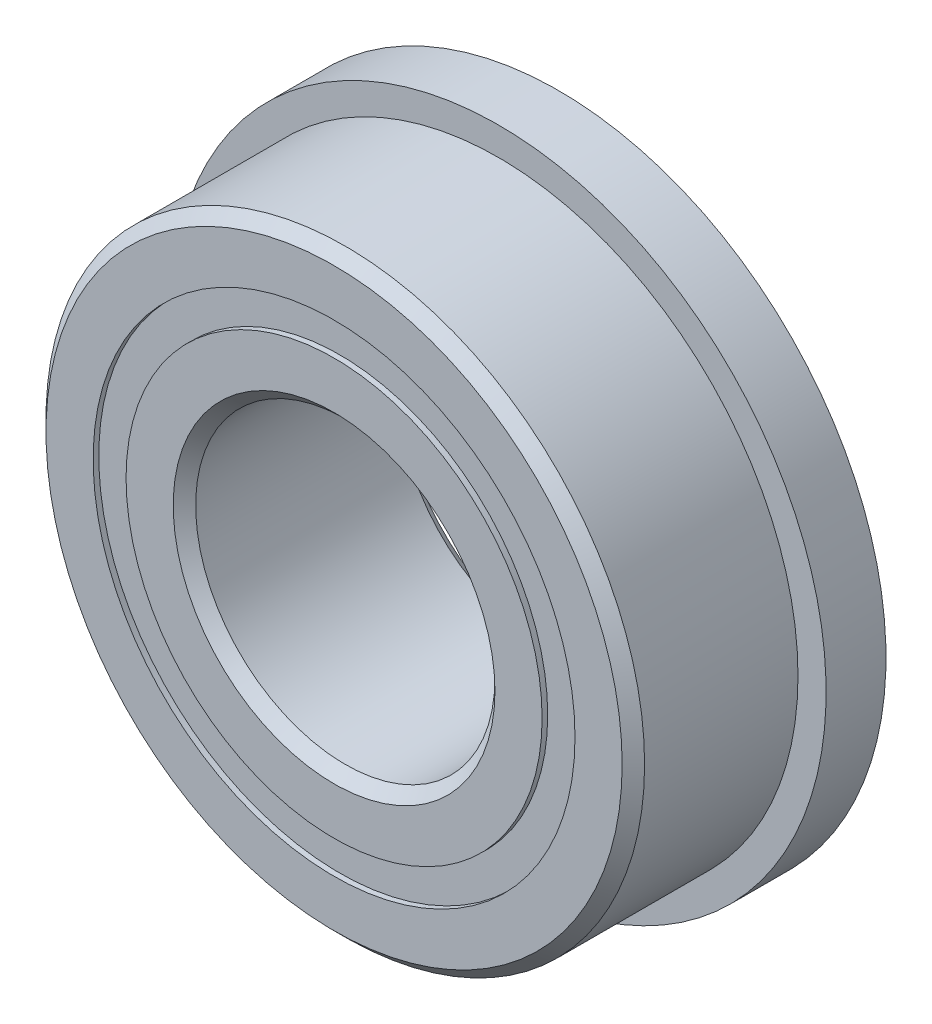
ISO-10303-21;
HEADER;
FILE_DESCRIPTION(('STEP AP214'),'2;1');
FILE_NAME('part.step','',(''),(''),'','','');
FILE_SCHEMA(('AUTOMOTIVE_DESIGN { 1 0 10303 214 1 1 1 1 }'));
ENDSEC;
DATA;
#1=APPLICATION_CONTEXT('core data for automotive mechanical design processes');
#2=APPLICATION_PROTOCOL_DEFINITION('international standard','automotive_design',2000,#1);
#3=PRODUCT_CONTEXT('',#1,'mechanical');
#4=PRODUCT('Part','Part','',(#3));
#5=PRODUCT_RELATED_PRODUCT_CATEGORY('part','',(#4));
#6=PRODUCT_DEFINITION_FORMATION('','',#4);
#7=PRODUCT_DEFINITION_CONTEXT('part definition',#1,'design');
#8=PRODUCT_DEFINITION('design','',#6,#7);
#9=PRODUCT_DEFINITION_SHAPE('','',#8);
#10=(LENGTH_UNIT() NAMED_UNIT(*) SI_UNIT(.MILLI.,.METRE.));
#11=(NAMED_UNIT(*) PLANE_ANGLE_UNIT() SI_UNIT($,.RADIAN.));
#12=(NAMED_UNIT(*) SI_UNIT($,.STERADIAN.) SOLID_ANGLE_UNIT());
#13=UNCERTAINTY_MEASURE_WITH_UNIT(LENGTH_MEASURE(1.E-05),#10,'distance_accuracy_value','');
#14=(GEOMETRIC_REPRESENTATION_CONTEXT(3) GLOBAL_UNCERTAINTY_ASSIGNED_CONTEXT((#13)) GLOBAL_UNIT_ASSIGNED_CONTEXT((#10,
#11,#12)) REPRESENTATION_CONTEXT('',''));
#15=CARTESIAN_POINT('',(0.,0.,0.));
#16=DIRECTION('',(0.,0.,1.));
#17=DIRECTION('',(1.,0.,0.));
#18=AXIS2_PLACEMENT_3D('',#15,#16,#17);
#19=CARTESIAN_POINT('',(0.,5.1114010989011,-2.2621875));
#20=DIRECTION('',(0.,0.,1.));
#21=DIRECTION('',(1.,0.,0.));
#22=AXIS2_PLACEMENT_3D('',#19,#20,#21);
#23=PLANE('',#22);
#24=CARTESIAN_POINT('',(0.,0.,-2.2621875));
#25=DIRECTION('',(0.,0.,1.));
#26=DIRECTION('',(1.,0.,0.));
#27=AXIS2_PLACEMENT_3D('',#24,#25,#26);
#28=CIRCLE('',#27,5.1114010989011);
#29=CARTESIAN_POINT('',(5.1114010989011,0.,-2.2621875));
#30=VERTEX_POINT('',#29);
#31=EDGE_CURVE('E55',#30,#30,#28,.T.);
#32=ORIENTED_EDGE('',*,*,#31,.F.);
#33=EDGE_LOOP('',(#32));
#34=FACE_BOUND('',#33,.T.);
#35=CARTESIAN_POINT('',(0.,0.,-2.2621875));
#36=DIRECTION('',(0.,0.,1.));
#37=DIRECTION('',(1.,0.,0.));
#38=AXIS2_PLACEMENT_3D('',#35,#36,#37);
#39=CIRCLE('',#38,4.4135989010989);
#40=CARTESIAN_POINT('',(4.4135989010989,0.,-2.2621875));
#41=VERTEX_POINT('',#40);
#42=EDGE_CURVE('E11',#41,#41,#39,.T.);
#43=ORIENTED_EDGE('',*,*,#42,.T.);
#44=EDGE_LOOP('',(#43));
#45=FACE_BOUND('',#44,.T.);
#46=ADVANCED_FACE('F41',(#34,#45),#23,.F.);
#47=CARTESIAN_POINT('',(0.,0.,2.38125));
#48=DIRECTION('',(0.,0.,1.));
#49=DIRECTION('',(1.,0.,0.));
#50=AXIS2_PLACEMENT_3D('',#47,#48,#49);
#51=CYLINDRICAL_SURFACE('',#50,4.4135989010989);
#52=ORIENTED_EDGE('',*,*,#42,.F.);
#53=EDGE_LOOP('',(#52));
#54=FACE_BOUND('',#53,.T.);
#55=CARTESIAN_POINT('',(0.,0.,-1.11436144103197));
#56=DIRECTION('',(0.,0.,1.));
#57=DIRECTION('',(1.,0.,0.));
#58=AXIS2_PLACEMENT_3D('',#55,#56,#57);
#59=CIRCLE('',#58,4.4135989010989);
#60=CARTESIAN_POINT('',(4.4135989010989,0.,-1.11436144103197));
#61=VERTEX_POINT('',#60);
#62=EDGE_CURVE('E47',#61,#61,#59,.T.);
#63=ORIENTED_EDGE('',*,*,#62,.T.);
#64=EDGE_LOOP('',(#63));
#65=FACE_BOUND('',#64,.T.);
#66=ADVANCED_FACE('F64',(#54,#65),#51,.F.);
#67=CARTESIAN_POINT('',(0.,5.1114010989011,-1.11436144103197));
#68=DIRECTION('',(0.,0.,-1.));
#69=DIRECTION('',(-1.,0.,0.));
#70=AXIS2_PLACEMENT_3D('',#67,#68,#69);
#71=PLANE('',#70);
#72=ORIENTED_EDGE('',*,*,#62,.F.);
#73=EDGE_LOOP('',(#72));
#74=FACE_BOUND('',#73,.T.);
#75=CARTESIAN_POINT('',(0.,0.,-1.11436144103197));
#76=DIRECTION('',(0.,0.,1.));
#77=DIRECTION('',(1.,0.,0.));
#78=AXIS2_PLACEMENT_3D('',#75,#76,#77);
#79=CIRCLE('',#78,5.1114010989011);
#80=CARTESIAN_POINT('',(5.1114010989011,0.,-1.11436144103197));
#81=VERTEX_POINT('',#80);
#82=EDGE_CURVE('E51',#81,#81,#79,.T.);
#83=ORIENTED_EDGE('',*,*,#82,.T.);
#84=EDGE_LOOP('',(#83));
#85=FACE_BOUND('',#84,.T.);
#86=ADVANCED_FACE('F68',(#74,#85),#71,.F.);
#87=CARTESIAN_POINT('',(0.,0.,2.38125));
#88=DIRECTION('',(0.,0.,1.));
#89=DIRECTION('',(1.,0.,0.));
#90=AXIS2_PLACEMENT_3D('',#87,#88,#89);
#91=CYLINDRICAL_SURFACE('',#90,5.1114010989011);
#92=ORIENTED_EDGE('',*,*,#82,.F.);
#93=EDGE_LOOP('',(#92));
#94=FACE_BOUND('',#93,.T.);
#95=ORIENTED_EDGE('',*,*,#31,.T.);
#96=EDGE_LOOP('',(#95));
#97=FACE_BOUND('',#96,.T.);
#98=ADVANCED_FACE('F61',(#94,#97),#91,.T.);
#99=CLOSED_SHELL('',(#46,#66,#86,#98));
#100=MANIFOLD_SOLID_BREP('B2',#99);
#101=CARTESIAN_POINT('',(0.,5.1114010989011,2.2621875));
#102=DIRECTION('',(0.,0.,-1.));
#103=DIRECTION('',(-1.,0.,0.));
#104=AXIS2_PLACEMENT_3D('',#101,#102,#103);
#105=PLANE('',#104);
#106=CARTESIAN_POINT('',(0.,0.,2.2621875));
#107=DIRECTION('',(0.,0.,1.));
#108=DIRECTION('',(1.,0.,0.));
#109=AXIS2_PLACEMENT_3D('',#106,#107,#108);
#110=CIRCLE('',#109,4.4135989010989);
#111=CARTESIAN_POINT('',(4.4135989010989,0.,2.2621875));
#112=VERTEX_POINT('',#111);
#113=EDGE_CURVE('E40',#112,#112,#110,.T.);
#114=ORIENTED_EDGE('',*,*,#113,.F.);
#115=EDGE_LOOP('',(#114));
#116=FACE_BOUND('',#115,.T.);
#117=CARTESIAN_POINT('',(0.,0.,2.2621875));
#118=DIRECTION('',(0.,0.,1.));
#119=DIRECTION('',(1.,0.,0.));
#120=AXIS2_PLACEMENT_3D('',#117,#118,#119);
#121=CIRCLE('',#120,5.1114010989011);
#122=CARTESIAN_POINT('',(5.1114010989011,0.,2.2621875));
#123=VERTEX_POINT('',#122);
#124=EDGE_CURVE('E122',#123,#123,#121,.T.);
#125=ORIENTED_EDGE('',*,*,#124,.T.);
#126=EDGE_LOOP('',(#125));
#127=FACE_BOUND('',#126,.T.);
#128=ADVANCED_FACE('F108',(#116,#127),#105,.F.);
#129=CARTESIAN_POINT('',(0.,0.,2.38125));
#130=DIRECTION('',(0.,0.,1.));
#131=DIRECTION('',(1.,0.,0.));
#132=AXIS2_PLACEMENT_3D('',#129,#130,#131);
#133=CYLINDRICAL_SURFACE('',#132,4.4135989010989);
#134=CARTESIAN_POINT('',(0.,0.,1.11436144103197));
#135=DIRECTION('',(0.,0.,1.));
#136=DIRECTION('',(1.,0.,0.));
#137=AXIS2_PLACEMENT_3D('',#134,#135,#136);
#138=CIRCLE('',#137,4.4135989010989);
#139=CARTESIAN_POINT('',(4.4135989010989,0.,1.11436144103197));
#140=VERTEX_POINT('',#139);
#141=EDGE_CURVE('E114',#140,#140,#138,.T.);
#142=ORIENTED_EDGE('',*,*,#141,.F.);
#143=EDGE_LOOP('',(#142));
#144=FACE_BOUND('',#143,.T.);
#145=ORIENTED_EDGE('',*,*,#113,.T.);
#146=EDGE_LOOP('',(#145));
#147=FACE_BOUND('',#146,.T.);
#148=ADVANCED_FACE('F137',(#144,#147),#133,.F.);
#149=CARTESIAN_POINT('',(0.,5.1114010989011,1.11436144103197));
#150=DIRECTION('',(0.,0.,1.));
#151=DIRECTION('',(1.,0.,0.));
#152=AXIS2_PLACEMENT_3D('',#149,#150,#151);
#153=PLANE('',#152);
#154=CARTESIAN_POINT('',(0.,0.,1.11436144103197));
#155=DIRECTION('',(0.,0.,1.));
#156=DIRECTION('',(1.,0.,0.));
#157=AXIS2_PLACEMENT_3D('',#154,#155,#156);
#158=CIRCLE('',#157,5.1114010989011);
#159=CARTESIAN_POINT('',(5.1114010989011,0.,1.11436144103197));
#160=VERTEX_POINT('',#159);
#161=EDGE_CURVE('E118',#160,#160,#158,.T.);
#162=ORIENTED_EDGE('',*,*,#161,.F.);
#163=EDGE_LOOP('',(#162));
#164=FACE_BOUND('',#163,.T.);
#165=ORIENTED_EDGE('',*,*,#141,.T.);
#166=EDGE_LOOP('',(#165));
#167=FACE_BOUND('',#166,.T.);
#168=ADVANCED_FACE('F132',(#164,#167),#153,.F.);
#169=CARTESIAN_POINT('',(0.,0.,2.38125));
#170=DIRECTION('',(0.,0.,1.));
#171=DIRECTION('',(1.,0.,0.));
#172=AXIS2_PLACEMENT_3D('',#169,#170,#171);
#173=CYLINDRICAL_SURFACE('',#172,5.1114010989011);
#174=ORIENTED_EDGE('',*,*,#124,.F.);
#175=EDGE_LOOP('',(#174));
#176=FACE_BOUND('',#175,.T.);
#177=ORIENTED_EDGE('',*,*,#161,.T.);
#178=EDGE_LOOP('',(#177));
#179=FACE_BOUND('',#178,.T.);
#180=ADVANCED_FACE('F129',(#176,#179),#173,.T.);
#181=CLOSED_SHELL('',(#128,#148,#168,#180));
#182=MANIFOLD_SOLID_BREP('B6',#181);
#183=CARTESIAN_POINT('',(-2.38124999999995,4.12444598552342,0.));
#184=DIRECTION('',(0.,0.,1.));
#185=DIRECTION('',(-0.499999999999989,0.866025403784445,0.));
#186=AXIS2_PLACEMENT_3D('',#183,#184,#185);
#187=SPHERICAL_SURFACE('',#186,1.11436144103197);
#188=CARTESIAN_POINT('',(-2.38124999999995,4.12444598552342,1.11436144103197));
#189=VERTEX_POINT('',#188);
#190=VERTEX_LOOP('',#189);
#191=FACE_BOUND('',#190,.T.);
#192=ADVANCED_FACE('F175',(#191),#187,.T.);
#193=CLOSED_SHELL('',(#192));
#194=MANIFOLD_SOLID_BREP('B35',#193);
#195=CARTESIAN_POINT('',(-4.12444598552336,2.38125000000005,0.));
#196=DIRECTION('',(0.,0.,1.));
#197=DIRECTION('',(-0.866025403784433,0.50000000000001,0.));
#198=AXIS2_PLACEMENT_3D('',#195,#196,#197);
#199=SPHERICAL_SURFACE('',#198,1.11436144103197);
#200=CARTESIAN_POINT('',(-4.12444598552336,2.38125000000005,1.11436144103197));
#201=VERTEX_POINT('',#200);
#202=VERTEX_LOOP('',#201);
#203=FACE_BOUND('',#202,.T.);
#204=ADVANCED_FACE('F195',(#203),#199,.T.);
#205=CLOSED_SHELL('',(#204));
#206=MANIFOLD_SOLID_BREP('B104',#205);
#207=CARTESIAN_POINT('',(-4.7625,0.,0.));
#208=DIRECTION('',(0.,0.,1.));
#209=DIRECTION('',(-1.,0.,0.));
#210=AXIS2_PLACEMENT_3D('',#207,#208,#209);
#211=SPHERICAL_SURFACE('',#210,1.11436144103197);
#212=CARTESIAN_POINT('',(-4.7625,0.,1.11436144103197));
#213=VERTEX_POINT('',#212);
#214=VERTEX_LOOP('',#213);
#215=FACE_BOUND('',#214,.T.);
#216=ADVANCED_FACE('F215',(#215),#211,.T.);
#217=CLOSED_SHELL('',(#216));
#218=MANIFOLD_SOLID_BREP('B171',#217);
#219=CARTESIAN_POINT('',(-4.12444598552341,-2.38124999999996,0.));
#220=DIRECTION('',(0.,0.,1.));
#221=DIRECTION('',(-0.866025403784443,-0.499999999999992,0.));
#222=AXIS2_PLACEMENT_3D('',#219,#220,#221);
#223=SPHERICAL_SURFACE('',#222,1.11436144103197);
#224=CARTESIAN_POINT('',(-4.12444598552341,-2.38124999999996,1.11436144103197));
#225=VERTEX_POINT('',#224);
#226=VERTEX_LOOP('',#225);
#227=FACE_BOUND('',#226,.T.);
#228=ADVANCED_FACE('F235',(#227),#223,.T.);
#229=CLOSED_SHELL('',(#228));
#230=MANIFOLD_SOLID_BREP('B191',#229);
#231=CARTESIAN_POINT('',(-2.38125000000003,-4.12444598552337,0.));
#232=DIRECTION('',(0.,0.,1.));
#233=DIRECTION('',(-0.500000000000007,-0.866025403784435,0.));
#234=AXIS2_PLACEMENT_3D('',#231,#232,#233);
#235=SPHERICAL_SURFACE('',#234,1.11436144103197);
#236=CARTESIAN_POINT('',(-2.38125000000003,-4.12444598552337,1.11436144103197));
#237=VERTEX_POINT('',#236);
#238=VERTEX_LOOP('',#237);
#239=FACE_BOUND('',#238,.T.);
#240=ADVANCED_FACE('F255',(#239),#235,.T.);
#241=CLOSED_SHELL('',(#240));
#242=MANIFOLD_SOLID_BREP('B211',#241);
#243=CARTESIAN_POINT('',(0.,-4.7625,0.));
#244=DIRECTION('',(0.,0.,1.));
#245=DIRECTION('',(0.,-1.,0.));
#246=AXIS2_PLACEMENT_3D('',#243,#244,#245);
#247=SPHERICAL_SURFACE('',#246,1.11436144103197);
#248=CARTESIAN_POINT('',(0.,-4.7625,1.11436144103197));
#249=VERTEX_POINT('',#248);
#250=VERTEX_LOOP('',#249);
#251=FACE_BOUND('',#250,.T.);
#252=ADVANCED_FACE('F275',(#251),#247,.T.);
#253=CLOSED_SHELL('',(#252));
#254=MANIFOLD_SOLID_BREP('B231',#253);
#255=CARTESIAN_POINT('',(2.38124999999998,-4.1244459855234,0.));
#256=DIRECTION('',(0.,0.,1.));
#257=DIRECTION('',(0.499999999999995,-0.866025403784442,0.));
#258=AXIS2_PLACEMENT_3D('',#255,#256,#257);
#259=SPHERICAL_SURFACE('',#258,1.11436144103197);
#260=CARTESIAN_POINT('',(2.38124999999998,-4.1244459855234,1.11436144103197));
#261=VERTEX_POINT('',#260);
#262=VERTEX_LOOP('',#261);
#263=FACE_BOUND('',#262,.T.);
#264=ADVANCED_FACE('F295',(#263),#259,.T.);
#265=CLOSED_SHELL('',(#264));
#266=MANIFOLD_SOLID_BREP('B251',#265);
#267=CARTESIAN_POINT('',(4.12444598552338,-2.38125000000002,0.));
#268=DIRECTION('',(0.,0.,1.));
#269=DIRECTION('',(0.866025403784436,-0.500000000000004,0.));
#270=AXIS2_PLACEMENT_3D('',#267,#268,#269);
#271=SPHERICAL_SURFACE('',#270,1.11436144103197);
#272=CARTESIAN_POINT('',(4.12444598552338,-2.38125000000002,1.11436144103197));
#273=VERTEX_POINT('',#272);
#274=VERTEX_LOOP('',#273);
#275=FACE_BOUND('',#274,.T.);
#276=ADVANCED_FACE('F315',(#275),#271,.T.);
#277=CLOSED_SHELL('',(#276));
#278=MANIFOLD_SOLID_BREP('B271',#277);
#279=CARTESIAN_POINT('',(4.7625,0.,0.));
#280=DIRECTION('',(0.,0.,1.));
#281=DIRECTION('',(1.,0.,0.));
#282=AXIS2_PLACEMENT_3D('',#279,#280,#281);
#283=SPHERICAL_SURFACE('',#282,1.11436144103197);
#284=CARTESIAN_POINT('',(4.7625,0.,1.11436144103197));
#285=VERTEX_POINT('',#284);
#286=VERTEX_LOOP('',#285);
#287=FACE_BOUND('',#286,.T.);
#288=ADVANCED_FACE('F335',(#287),#283,.T.);
#289=CLOSED_SHELL('',(#288));
#290=MANIFOLD_SOLID_BREP('B291',#289);
#291=CARTESIAN_POINT('',(4.12444598552339,2.38124999999999,0.));
#292=DIRECTION('',(0.,0.,1.));
#293=DIRECTION('',(0.86602540378444,0.499999999999998,0.));
#294=AXIS2_PLACEMENT_3D('',#291,#292,#293);
#295=SPHERICAL_SURFACE('',#294,1.11436144103197);
#296=CARTESIAN_POINT('',(4.12444598552339,2.38124999999999,1.11436144103197));
#297=VERTEX_POINT('',#296);
#298=VERTEX_LOOP('',#297);
#299=FACE_BOUND('',#298,.T.);
#300=ADVANCED_FACE('F355',(#299),#295,.T.);
#301=CLOSED_SHELL('',(#300));
#302=MANIFOLD_SOLID_BREP('B311',#301);
#303=CARTESIAN_POINT('',(2.38125,4.12444598552339,0.));
#304=DIRECTION('',(0.,0.,1.));
#305=DIRECTION('',(0.500000000000001,0.866025403784438,0.));
#306=AXIS2_PLACEMENT_3D('',#303,#304,#305);
#307=SPHERICAL_SURFACE('',#306,1.11436144103197);
#308=CARTESIAN_POINT('',(2.38125,4.12444598552339,1.11436144103197));
#309=VERTEX_POINT('',#308);
#310=VERTEX_LOOP('',#309);
#311=FACE_BOUND('',#310,.T.);
#312=ADVANCED_FACE('F375',(#311),#307,.T.);
#313=CLOSED_SHELL('',(#312));
#314=MANIFOLD_SOLID_BREP('B331',#313);
#315=CARTESIAN_POINT('',(0.,4.7625,0.));
#316=DIRECTION('',(0.,0.,1.));
#317=DIRECTION('',(0.,1.,0.));
#318=AXIS2_PLACEMENT_3D('',#315,#316,#317);
#319=SPHERICAL_SURFACE('',#318,1.11436144103197);
#320=CARTESIAN_POINT('',(0.,4.7625,1.11436144103197));
#321=VERTEX_POINT('',#320);
#322=VERTEX_LOOP('',#321);
#323=FACE_BOUND('',#322,.T.);
#324=ADVANCED_FACE('F397',(#323),#319,.T.);
#325=CLOSED_SHELL('',(#324));
#326=MANIFOLD_SOLID_BREP('B351',#325);
#327=CARTESIAN_POINT('',(0.,4.4135989010989,2.38125));
#328=DIRECTION('',(0.,0.,-1.));
#329=DIRECTION('',(-1.,0.,0.));
#330=AXIS2_PLACEMENT_3D('',#327,#328,#329);
#331=PLANE('',#330);
#332=CARTESIAN_POINT('',(0.,0.,2.38125));
#333=DIRECTION('',(0.,0.,1.));
#334=DIRECTION('',(1.,0.,0.));
#335=AXIS2_PLACEMENT_3D('',#332,#333,#334);
#336=CIRCLE('',#335,3.413125);
#337=CARTESIAN_POINT('',(3.413125,0.,2.38125));
#338=VERTEX_POINT('',#337);
#339=EDGE_CURVE('E444',#338,#338,#336,.T.);
#340=ORIENTED_EDGE('',*,*,#339,.F.);
#341=EDGE_LOOP('',(#340));
#342=FACE_BOUND('',#341,.T.);
#343=CARTESIAN_POINT('',(0.,0.,2.38125));
#344=DIRECTION('',(0.,0.,1.));
#345=DIRECTION('',(1.,0.,0.));
#346=AXIS2_PLACEMENT_3D('',#343,#344,#345);
#347=CIRCLE('',#346,4.4135989010989);
#348=CARTESIAN_POINT('',(4.4135989010989,0.,2.38125));
#349=VERTEX_POINT('',#348);
#350=EDGE_CURVE('E396',#349,#349,#347,.T.);
#351=ORIENTED_EDGE('',*,*,#350,.T.);
#352=EDGE_LOOP('',(#351));
#353=FACE_BOUND('',#352,.T.);
#354=ADVANCED_FACE('F416',(#342,#353),#331,.F.);
#355=CARTESIAN_POINT('',(0.,0.,2.38125));
#356=DIRECTION('',(0.,0.,1.));
#357=DIRECTION('',(1.,0.,0.));
#358=AXIS2_PLACEMENT_3D('',#355,#356,#357);
#359=CYLINDRICAL_SURFACE('',#358,4.4135989010989);
#360=ORIENTED_EDGE('',*,*,#350,.F.);
#361=EDGE_LOOP('',(#360));
#362=FACE_BOUND('',#361,.T.);
#363=CARTESIAN_POINT('',(0.,0.,1.05833333333333));
#364=DIRECTION('',(0.,0.,1.));
#365=DIRECTION('',(1.,0.,0.));
#366=AXIS2_PLACEMENT_3D('',#363,#364,#365);
#367=CIRCLE('',#366,4.4135989010989);
#368=CARTESIAN_POINT('',(4.4135989010989,0.,1.05833333333333));
#369=VERTEX_POINT('',#368);
#370=EDGE_CURVE('E422',#369,#369,#367,.T.);
#371=ORIENTED_EDGE('',*,*,#370,.T.);
#372=EDGE_LOOP('',(#371));
#373=FACE_BOUND('',#372,.T.);
#374=ADVANCED_FACE('F451',(#362,#373),#359,.T.);
#375=CARTESIAN_POINT('',(0.,0.,0.));
#376=DIRECTION('',(0.,0.,1.));
#377=DIRECTION('',(1.,0.,0.));
#378=AXIS2_PLACEMENT_3D('',#375,#376,#377);
#379=TOROIDAL_SURFACE('',#378,4.76249999999999,1.11436144103196);
#380=ORIENTED_EDGE('',*,*,#370,.F.);
#381=EDGE_LOOP('',(#380));
#382=FACE_BOUND('',#381,.T.);
#383=CARTESIAN_POINT('',(0.,0.,-1.05833333333334));
#384=DIRECTION('',(0.,0.,1.));
#385=DIRECTION('',(1.,0.,0.));
#386=AXIS2_PLACEMENT_3D('',#383,#384,#385);
#387=CIRCLE('',#386,4.4135989010989);
#388=CARTESIAN_POINT('',(4.4135989010989,0.,-1.05833333333334));
#389=VERTEX_POINT('',#388);
#390=EDGE_CURVE('E426',#389,#389,#387,.T.);
#391=ORIENTED_EDGE('',*,*,#390,.T.);
#392=EDGE_LOOP('',(#391));
#393=FACE_BOUND('',#392,.T.);
#394=ADVANCED_FACE('F455',(#382,#393),#379,.F.);
#395=CARTESIAN_POINT('',(0.,0.,2.38125));
#396=DIRECTION('',(0.,0.,1.));
#397=DIRECTION('',(1.,0.,0.));
#398=AXIS2_PLACEMENT_3D('',#395,#396,#397);
#399=CYLINDRICAL_SURFACE('',#398,4.4135989010989);
#400=ORIENTED_EDGE('',*,*,#390,.F.);
#401=EDGE_LOOP('',(#400));
#402=FACE_BOUND('',#401,.T.);
#403=CARTESIAN_POINT('',(0.,0.,-2.38125));
#404=DIRECTION('',(0.,0.,1.));
#405=DIRECTION('',(1.,0.,0.));
#406=AXIS2_PLACEMENT_3D('',#403,#404,#405);
#407=CIRCLE('',#406,4.4135989010989);
#408=CARTESIAN_POINT('',(4.4135989010989,0.,-2.38125));
#409=VERTEX_POINT('',#408);
#410=EDGE_CURVE('E430',#409,#409,#407,.T.);
#411=ORIENTED_EDGE('',*,*,#410,.T.);
#412=EDGE_LOOP('',(#411));
#413=FACE_BOUND('',#412,.T.);
#414=ADVANCED_FACE('F460',(#402,#413),#399,.T.);
#415=CARTESIAN_POINT('',(0.,3.413125,-2.38125));
#416=DIRECTION('',(0.,0.,1.));
#417=DIRECTION('',(1.,0.,0.));
#418=AXIS2_PLACEMENT_3D('',#415,#416,#417);
#419=PLANE('',#418);
#420=ORIENTED_EDGE('',*,*,#410,.F.);
#421=EDGE_LOOP('',(#420));
#422=FACE_BOUND('',#421,.T.);
#423=CARTESIAN_POINT('',(0.,0.,-2.38125));
#424=DIRECTION('',(0.,0.,1.));
#425=DIRECTION('',(1.,0.,0.));
#426=AXIS2_PLACEMENT_3D('',#423,#424,#425);
#427=CIRCLE('',#426,3.413125);
#428=CARTESIAN_POINT('',(3.413125,0.,-2.38125));
#429=VERTEX_POINT('',#428);
#430=EDGE_CURVE('E435',#429,#429,#427,.T.);
#431=ORIENTED_EDGE('',*,*,#430,.T.);
#432=EDGE_LOOP('',(#431));
#433=FACE_BOUND('',#432,.T.);
#434=ADVANCED_FACE('F466',(#422,#433),#419,.F.);
#435=CARTESIAN_POINT('',(0.,0.,-2.143125));
#436=DIRECTION('',(0.,0.,-1.));
#437=DIRECTION('',(-1.,0.,0.));
#438=AXIS2_PLACEMENT_3D('',#435,#436,#437);
#439=CONICAL_SURFACE('',#438,3.175,0.785398163397447);
#440=ORIENTED_EDGE('',*,*,#430,.F.);
#441=EDGE_LOOP('',(#440));
#442=FACE_BOUND('',#441,.T.);
#443=CARTESIAN_POINT('',(0.,0.,-2.143125));
#444=DIRECTION('',(0.,0.,1.));
#445=DIRECTION('',(1.,0.,0.));
#446=AXIS2_PLACEMENT_3D('',#443,#444,#445);
#447=CIRCLE('',#446,3.175);
#448=CARTESIAN_POINT('',(3.175,0.,-2.143125));
#449=VERTEX_POINT('',#448);
#450=EDGE_CURVE('E438',#449,#449,#447,.T.);
#451=ORIENTED_EDGE('',*,*,#450,.T.);
#452=EDGE_LOOP('',(#451));
#453=FACE_BOUND('',#452,.T.);
#454=ADVANCED_FACE('F470',(#442,#453),#439,.F.);
#455=CARTESIAN_POINT('',(0.,0.,2.38125));
#456=DIRECTION('',(0.,0.,1.));
#457=DIRECTION('',(1.,0.,0.));
#458=AXIS2_PLACEMENT_3D('',#455,#456,#457);
#459=CYLINDRICAL_SURFACE('',#458,3.175);
#460=ORIENTED_EDGE('',*,*,#450,.F.);
#461=EDGE_LOOP('',(#460));
#462=FACE_BOUND('',#461,.T.);
#463=CARTESIAN_POINT('',(0.,0.,2.143125));
#464=DIRECTION('',(0.,0.,1.));
#465=DIRECTION('',(1.,0.,0.));
#466=AXIS2_PLACEMENT_3D('',#463,#464,#465);
#467=CIRCLE('',#466,3.175);
#468=CARTESIAN_POINT('',(3.175,0.,2.143125));
#469=VERTEX_POINT('',#468);
#470=EDGE_CURVE('E441',#469,#469,#467,.T.);
#471=ORIENTED_EDGE('',*,*,#470,.T.);
#472=EDGE_LOOP('',(#471));
#473=FACE_BOUND('',#472,.T.);
#474=ADVANCED_FACE('F474',(#462,#473),#459,.F.);
#475=CARTESIAN_POINT('',(0.,0.,2.38125));
#476=DIRECTION('',(0.,0.,1.));
#477=DIRECTION('',(1.,0.,0.));
#478=AXIS2_PLACEMENT_3D('',#475,#476,#477);
#479=CONICAL_SURFACE('',#478,3.413125,0.785398163397451);
#480=ORIENTED_EDGE('',*,*,#470,.F.);
#481=EDGE_LOOP('',(#480));
#482=FACE_BOUND('',#481,.T.);
#483=ORIENTED_EDGE('',*,*,#339,.T.);
#484=EDGE_LOOP('',(#483));
#485=FACE_BOUND('',#484,.T.);
#486=ADVANCED_FACE('F448',(#482,#485),#479,.F.);
#487=CLOSED_SHELL('',(#354,#374,#394,#414,#434,#454,#474,#486));
#488=MANIFOLD_SOLID_BREP('B371',#487);
#489=CARTESIAN_POINT('',(0.,0.,2.143125));
#490=DIRECTION('',(0.,0.,-1.));
#491=DIRECTION('',(-1.,0.,0.));
#492=AXIS2_PLACEMENT_3D('',#489,#490,#491);
#493=CONICAL_SURFACE('',#492,6.35,0.785398163397447);
#494=CARTESIAN_POINT('',(0.,0.,2.38125));
#495=DIRECTION('',(0.,0.,1.));
#496=DIRECTION('',(1.,0.,0.));
#497=AXIS2_PLACEMENT_3D('',#494,#495,#496);
#498=CIRCLE('',#497,6.111875);
#499=CARTESIAN_POINT('',(6.111875,0.,2.38125));
#500=VERTEX_POINT('',#499);
#501=EDGE_CURVE('E559',#500,#500,#498,.T.);
#502=ORIENTED_EDGE('',*,*,#501,.F.);
#503=EDGE_LOOP('',(#502));
#504=FACE_BOUND('',#503,.T.);
#505=CARTESIAN_POINT('',(0.,0.,2.143125));
#506=DIRECTION('',(0.,0.,1.));
#507=DIRECTION('',(1.,0.,0.));
#508=AXIS2_PLACEMENT_3D('',#505,#506,#507);
#509=CIRCLE('',#508,6.35);
#510=CARTESIAN_POINT('',(6.35,0.,2.143125));
#511=VERTEX_POINT('',#510);
#512=EDGE_CURVE('E415',#511,#511,#509,.T.);
#513=ORIENTED_EDGE('',*,*,#512,.T.);
#514=EDGE_LOOP('',(#513));
#515=FACE_BOUND('',#514,.T.);
#516=ADVANCED_FACE('F537',(#504,#515),#493,.T.);
#517=CARTESIAN_POINT('',(0.,0.,2.38125));
#518=DIRECTION('',(0.,0.,1.));
#519=DIRECTION('',(1.,0.,0.));
#520=AXIS2_PLACEMENT_3D('',#517,#518,#519);
#521=CYLINDRICAL_SURFACE('',#520,6.35);
#522=CARTESIAN_POINT('',(0.,0.,-1.11125));
#523=DIRECTION('',(0.,0.,1.));
#524=DIRECTION('',(1.,0.,0.));
#525=AXIS2_PLACEMENT_3D('',#522,#523,#524);
#526=CIRCLE('',#525,6.35);
#527=CARTESIAN_POINT('',(6.35,0.,-1.11125));
#528=VERTEX_POINT('',#527);
#529=EDGE_CURVE('E562',#528,#528,#526,.T.);
#530=ORIENTED_EDGE('',*,*,#529,.T.);
#531=EDGE_LOOP('',(#530));
#532=FACE_BOUND('',#531,.T.);
#533=ORIENTED_EDGE('',*,*,#512,.F.);
#534=EDGE_LOOP('',(#533));
#535=FACE_BOUND('',#534,.T.);
#536=ADVANCED_FACE('F582',(#532,#535),#521,.T.);
#537=CARTESIAN_POINT('',(0.,6.111875,-2.38125));
#538=DIRECTION('',(0.,0.,1.));
#539=DIRECTION('',(1.,0.,0.));
#540=AXIS2_PLACEMENT_3D('',#537,#538,#539);
#541=PLANE('',#540);
#542=CARTESIAN_POINT('',(0.,0.,-2.38125));
#543=DIRECTION('',(0.,0.,1.));
#544=DIRECTION('',(1.,0.,0.));
#545=AXIS2_PLACEMENT_3D('',#542,#543,#544);
#546=CIRCLE('',#545,5.1114010989011);
#547=CARTESIAN_POINT('',(5.1114010989011,0.,-2.38125));
#548=VERTEX_POINT('',#547);
#549=EDGE_CURVE('E543',#548,#548,#546,.T.);
#550=ORIENTED_EDGE('',*,*,#549,.T.);
#551=EDGE_LOOP('',(#550));
#552=FACE_BOUND('',#551,.T.);
#553=CARTESIAN_POINT('',(0.,0.,-2.38125));
#554=DIRECTION('',(0.,0.,-1.));
#555=DIRECTION('',(-1.,0.,0.));
#556=AXIS2_PLACEMENT_3D('',#553,#554,#555);
#557=CIRCLE('',#556,6.9469);
#558=CARTESIAN_POINT('',(-6.9469,0.,-2.38125));
#559=VERTEX_POINT('',#558);
#560=EDGE_CURVE('E565',#559,#559,#557,.T.);
#561=ORIENTED_EDGE('',*,*,#560,.T.);
#562=EDGE_LOOP('',(#561));
#563=FACE_BOUND('',#562,.T.);
#564=ADVANCED_FACE('F585',(#552,#563),#541,.F.);
#565=CARTESIAN_POINT('',(0.,0.,2.38125));
#566=DIRECTION('',(0.,0.,1.));
#567=DIRECTION('',(1.,0.,0.));
#568=AXIS2_PLACEMENT_3D('',#565,#566,#567);
#569=CYLINDRICAL_SURFACE('',#568,5.1114010989011);
#570=CARTESIAN_POINT('',(0.,0.,-1.05833333333333));
#571=DIRECTION('',(0.,0.,1.));
#572=DIRECTION('',(1.,0.,0.));
#573=AXIS2_PLACEMENT_3D('',#570,#571,#572);
#574=CIRCLE('',#573,5.1114010989011);
#575=CARTESIAN_POINT('',(5.1114010989011,0.,-1.05833333333333));
#576=VERTEX_POINT('',#575);
#577=EDGE_CURVE('E547',#576,#576,#574,.T.);
#578=ORIENTED_EDGE('',*,*,#577,.T.);
#579=EDGE_LOOP('',(#578));
#580=FACE_BOUND('',#579,.T.);
#581=ORIENTED_EDGE('',*,*,#549,.F.);
#582=EDGE_LOOP('',(#581));
#583=FACE_BOUND('',#582,.T.);
#584=ADVANCED_FACE('F590',(#580,#583),#569,.F.);
#585=CARTESIAN_POINT('',(0.,0.,0.));
#586=DIRECTION('',(0.,0.,1.));
#587=DIRECTION('',(1.,0.,0.));
#588=AXIS2_PLACEMENT_3D('',#585,#586,#587);
#589=TOROIDAL_SURFACE('',#588,4.7625,1.11436144103197);
#590=ORIENTED_EDGE('',*,*,#577,.F.);
#591=EDGE_LOOP('',(#590));
#592=FACE_BOUND('',#591,.T.);
#593=CARTESIAN_POINT('',(0.,0.,1.05833333333333));
#594=DIRECTION('',(0.,0.,1.));
#595=DIRECTION('',(1.,0.,0.));
#596=AXIS2_PLACEMENT_3D('',#593,#594,#595);
#597=CIRCLE('',#596,5.1114010989011);
#598=CARTESIAN_POINT('',(5.1114010989011,0.,1.05833333333333));
#599=VERTEX_POINT('',#598);
#600=EDGE_CURVE('E551',#599,#599,#597,.T.);
#601=ORIENTED_EDGE('',*,*,#600,.T.);
#602=EDGE_LOOP('',(#601));
#603=FACE_BOUND('',#602,.T.);
#604=ADVANCED_FACE('F596',(#592,#603),#589,.F.);
#605=CARTESIAN_POINT('',(0.,0.,2.38125));
#606=DIRECTION('',(0.,0.,1.));
#607=DIRECTION('',(1.,0.,0.));
#608=AXIS2_PLACEMENT_3D('',#605,#606,#607);
#609=CYLINDRICAL_SURFACE('',#608,5.1114010989011);
#610=ORIENTED_EDGE('',*,*,#600,.F.);
#611=EDGE_LOOP('',(#610));
#612=FACE_BOUND('',#611,.T.);
#613=CARTESIAN_POINT('',(0.,0.,2.38125));
#614=DIRECTION('',(0.,0.,1.));
#615=DIRECTION('',(1.,0.,0.));
#616=AXIS2_PLACEMENT_3D('',#613,#614,#615);
#617=CIRCLE('',#616,5.1114010989011);
#618=CARTESIAN_POINT('',(5.1114010989011,0.,2.38125));
#619=VERTEX_POINT('',#618);
#620=EDGE_CURVE('E556',#619,#619,#617,.T.);
#621=ORIENTED_EDGE('',*,*,#620,.T.);
#622=EDGE_LOOP('',(#621));
#623=FACE_BOUND('',#622,.T.);
#624=ADVANCED_FACE('F600',(#612,#623),#609,.F.);
#625=CARTESIAN_POINT('',(0.,6.111875,2.38125));
#626=DIRECTION('',(0.,0.,-1.));
#627=DIRECTION('',(-1.,0.,0.));
#628=AXIS2_PLACEMENT_3D('',#625,#626,#627);
#629=PLANE('',#628);
#630=ORIENTED_EDGE('',*,*,#620,.F.);
#631=EDGE_LOOP('',(#630));
#632=FACE_BOUND('',#631,.T.);
#633=ORIENTED_EDGE('',*,*,#501,.T.);
#634=EDGE_LOOP('',(#633));
#635=FACE_BOUND('',#634,.T.);
#636=ADVANCED_FACE('F578',(#632,#635),#629,.F.);
#637=CARTESIAN_POINT('',(0.,5.1114010989011,-1.11125));
#638=DIRECTION('',(0.,0.,1.));
#639=DIRECTION('',(1.,0.,0.));
#640=AXIS2_PLACEMENT_3D('',#637,#638,#639);
#641=PLANE('',#640);
#642=CARTESIAN_POINT('',(0.,0.,-1.11125));
#643=DIRECTION('',(0.,0.,-1.));
#644=DIRECTION('',(-1.,0.,0.));
#645=AXIS2_PLACEMENT_3D('',#642,#643,#644);
#646=CIRCLE('',#645,6.9469);
#647=CARTESIAN_POINT('',(-6.9469,0.,-1.11125));
#648=VERTEX_POINT('',#647);
#649=EDGE_CURVE('E568',#648,#648,#646,.T.);
#650=ORIENTED_EDGE('',*,*,#649,.F.);
#651=EDGE_LOOP('',(#650));
#652=FACE_BOUND('',#651,.T.);
#653=ORIENTED_EDGE('',*,*,#529,.F.);
#654=EDGE_LOOP('',(#653));
#655=FACE_BOUND('',#654,.T.);
#656=ADVANCED_FACE('F575',(#652,#655),#641,.T.);
#657=CARTESIAN_POINT('',(0.,0.,-2.38125));
#658=DIRECTION('',(0.,0.,-1.));
#659=DIRECTION('',(-1.,0.,0.));
#660=AXIS2_PLACEMENT_3D('',#657,#658,#659);
#661=CYLINDRICAL_SURFACE('',#660,6.9469);
#662=ORIENTED_EDGE('',*,*,#649,.T.);
#663=EDGE_LOOP('',(#662));
#664=FACE_BOUND('',#663,.T.);
#665=ORIENTED_EDGE('',*,*,#560,.F.);
#666=EDGE_LOOP('',(#665));
#667=FACE_BOUND('',#666,.T.);
#668=ADVANCED_FACE('F572',(#664,#667),#661,.T.);
#669=CLOSED_SHELL('',(#516,#536,#564,#584,#604,#624,#636,#656,#668));
#670=MANIFOLD_SOLID_BREP('B391',#669);
#671=ADVANCED_BREP_SHAPE_REPRESENTATION('',(#18,#100,#182,#194,#206,#218,#230,#242,#254,#266,
#278,#290,#302,#314,#326,#488,#670),#14);
#672=SHAPE_DEFINITION_REPRESENTATION(#9,#671);
ENDSEC;
END-ISO-10303-21;
